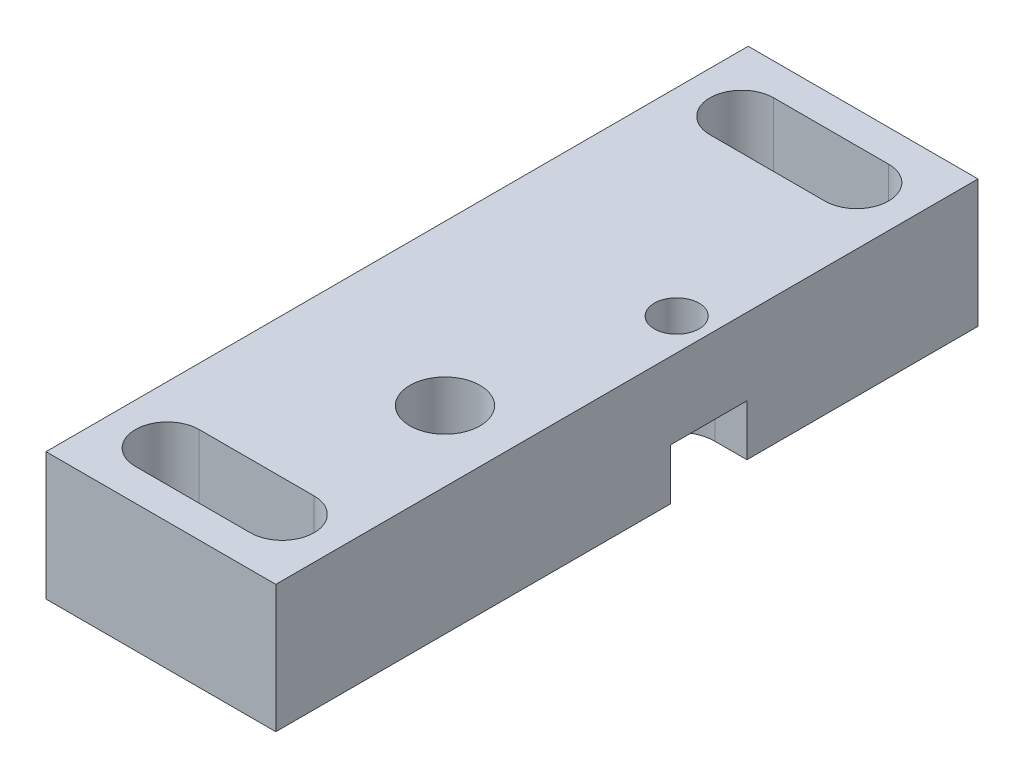
ISO-10303-21;
HEADER;
FILE_DESCRIPTION(('STEP AP214'),'2;1');
FILE_NAME('part.step','',(''),(''),'','','');
FILE_SCHEMA(('AUTOMOTIVE_DESIGN { 1 0 10303 214 1 1 1 1 }'));
ENDSEC;
DATA;
#1=APPLICATION_CONTEXT('core data for automotive mechanical design processes');
#2=APPLICATION_PROTOCOL_DEFINITION('international standard','automotive_design',2000,#1);
#3=PRODUCT_CONTEXT('',#1,'mechanical');
#4=PRODUCT('Part','Part','',(#3));
#5=PRODUCT_RELATED_PRODUCT_CATEGORY('part','',(#4));
#6=PRODUCT_DEFINITION_FORMATION('','',#4);
#7=PRODUCT_DEFINITION_CONTEXT('part definition',#1,'design');
#8=PRODUCT_DEFINITION('design','',#6,#7);
#9=PRODUCT_DEFINITION_SHAPE('','',#8);
#10=(LENGTH_UNIT() NAMED_UNIT(*) SI_UNIT(.MILLI.,.METRE.));
#11=(NAMED_UNIT(*) PLANE_ANGLE_UNIT() SI_UNIT($,.RADIAN.));
#12=(NAMED_UNIT(*) SI_UNIT($,.STERADIAN.) SOLID_ANGLE_UNIT());
#13=UNCERTAINTY_MEASURE_WITH_UNIT(LENGTH_MEASURE(1.E-05),#10,'distance_accuracy_value','');
#14=(GEOMETRIC_REPRESENTATION_CONTEXT(3) GLOBAL_UNCERTAINTY_ASSIGNED_CONTEXT((#13)) GLOBAL_UNIT_ASSIGNED_CONTEXT((#10,
#11,#12)) REPRESENTATION_CONTEXT('',''));
#15=CARTESIAN_POINT('',(0.,0.,0.));
#16=DIRECTION('',(0.,0.,1.));
#17=DIRECTION('',(1.,0.,0.));
#18=AXIS2_PLACEMENT_3D('',#15,#16,#17);
#19=CARTESIAN_POINT('',(0.,10.,0.));
#20=DIRECTION('',(0.,1.,0.));
#21=DIRECTION('',(0.,0.,1.));
#22=AXIS2_PLACEMENT_3D('',#19,#20,#21);
#23=PLANE('',#22);
#24=CARTESIAN_POINT('',(-4.5,10.,22.5));
#25=DIRECTION('',(0.,1.,0.));
#26=DIRECTION('',(0.,0.,1.));
#27=AXIS2_PLACEMENT_3D('',#24,#25,#26);
#28=CIRCLE('',#27,2.5);
#29=CARTESIAN_POINT('',(-4.5,10.,25.));
#30=VERTEX_POINT('',#29);
#31=CARTESIAN_POINT('',(-4.5,10.,20.));
#32=VERTEX_POINT('',#31);
#33=EDGE_CURVE('E188',#30,#32,#28,.F.);
#34=ORIENTED_EDGE('',*,*,#33,.T.);
#35=DIRECTION('',(-1.,0.,0.));
#36=VECTOR('',#35,1.);
#37=CARTESIAN_POINT('',(0.,10.,20.));
#38=LINE('',#37,#36);
#39=CARTESIAN_POINT('',(4.5,10.,20.));
#40=VERTEX_POINT('',#39);
#41=EDGE_CURVE('E195',#40,#32,#38,.T.);
#42=ORIENTED_EDGE('',*,*,#41,.F.);
#43=CARTESIAN_POINT('',(4.5,10.,22.5));
#44=DIRECTION('',(0.,1.,0.));
#45=DIRECTION('',(0.,0.,1.));
#46=AXIS2_PLACEMENT_3D('',#43,#44,#45);
#47=CIRCLE('',#46,2.5);
#48=CARTESIAN_POINT('',(4.5,10.,25.));
#49=VERTEX_POINT('',#48);
#50=EDGE_CURVE('E57',#40,#49,#47,.F.);
#51=ORIENTED_EDGE('',*,*,#50,.T.);
#52=DIRECTION('',(1.,0.,0.));
#53=VECTOR('',#52,1.);
#54=CARTESIAN_POINT('',(0.,10.,25.));
#55=LINE('',#54,#53);
#56=EDGE_CURVE('E191',#30,#49,#55,.T.);
#57=ORIENTED_EDGE('',*,*,#56,.F.);
#58=EDGE_LOOP('',(#34,#42,#51,#57));
#59=FACE_BOUND('',#58,.T.);
#60=CARTESIAN_POINT('',(3.5,10.,8.75000000000001));
#61=DIRECTION('',(0.,1.,0.));
#62=DIRECTION('',(0.,0.,1.));
#63=AXIS2_PLACEMENT_3D('',#60,#61,#62);
#64=CIRCLE('',#63,2.75);
#65=CARTESIAN_POINT('',(3.5,10.,11.5));
#66=VERTEX_POINT('',#65);
#67=EDGE_CURVE('E251',#66,#66,#64,.T.);
#68=ORIENTED_EDGE('',*,*,#67,.F.);
#69=EDGE_LOOP('',(#68));
#70=FACE_BOUND('',#69,.T.);
#71=CARTESIAN_POINT('',(6.5,10.,-6.4));
#72=DIRECTION('',(0.,1.,0.));
#73=DIRECTION('',(0.,0.,1.));
#74=AXIS2_PLACEMENT_3D('',#71,#72,#73);
#75=CIRCLE('',#74,1.75);
#76=CARTESIAN_POINT('',(6.5,10.,-4.65));
#77=VERTEX_POINT('',#76);
#78=EDGE_CURVE('E255',#77,#77,#75,.T.);
#79=ORIENTED_EDGE('',*,*,#78,.F.);
#80=EDGE_LOOP('',(#79));
#81=FACE_BOUND('',#80,.T.);
#82=DIRECTION('',(0.,0.,-1.));
#83=VECTOR('',#82,1.);
#84=CARTESIAN_POINT('',(9.,10.,-27.5));
#85=LINE('',#84,#83);
#86=CARTESIAN_POINT('',(9.,10.,27.5));
#87=VERTEX_POINT('',#86);
#88=CARTESIAN_POINT('',(9.,10.,-27.5));
#89=VERTEX_POINT('',#88);
#90=EDGE_CURVE('E258',#87,#89,#85,.T.);
#91=ORIENTED_EDGE('',*,*,#90,.T.);
#92=DIRECTION('',(-1.,0.,0.));
#93=VECTOR('',#92,1.);
#94=CARTESIAN_POINT('',(-9.,10.,-27.5));
#95=LINE('',#94,#93);
#96=CARTESIAN_POINT('',(-9.,10.,-27.5));
#97=VERTEX_POINT('',#96);
#98=EDGE_CURVE('E261',#89,#97,#95,.T.);
#99=ORIENTED_EDGE('',*,*,#98,.T.);
#100=DIRECTION('',(0.,0.,1.));
#101=VECTOR('',#100,1.);
#102=CARTESIAN_POINT('',(-9.,10.,-27.5));
#103=LINE('',#102,#101);
#104=CARTESIAN_POINT('',(-8.99999999999999,10.,27.5));
#105=VERTEX_POINT('',#104);
#106=EDGE_CURVE('E264',#97,#105,#103,.T.);
#107=ORIENTED_EDGE('',*,*,#106,.T.);
#108=DIRECTION('',(1.,0.,0.));
#109=VECTOR('',#108,1.);
#110=CARTESIAN_POINT('',(-8.99999999999999,10.,27.5));
#111=LINE('',#110,#109);
#112=EDGE_CURVE('E266',#105,#87,#111,.T.);
#113=ORIENTED_EDGE('',*,*,#112,.T.);
#114=EDGE_LOOP('',(#91,#99,#107,#113));
#115=FACE_BOUND('',#114,.T.);
#116=DIRECTION('',(-1.,0.,0.));
#117=VECTOR('',#116,1.);
#118=CARTESIAN_POINT('',(0.,10.,-20.));
#119=LINE('',#118,#117);
#120=CARTESIAN_POINT('',(4.5,10.,-20.));
#121=VERTEX_POINT('',#120);
#122=CARTESIAN_POINT('',(-4.5,10.,-20.));
#123=VERTEX_POINT('',#122);
#124=EDGE_CURVE('E158',#121,#123,#119,.T.);
#125=ORIENTED_EDGE('',*,*,#124,.T.);
#126=CARTESIAN_POINT('',(-4.5,10.,-22.5));
#127=DIRECTION('',(0.,1.,0.));
#128=DIRECTION('',(0.,0.,1.));
#129=AXIS2_PLACEMENT_3D('',#126,#127,#128);
#130=CIRCLE('',#129,2.5);
#131=CARTESIAN_POINT('',(-4.5,10.,-25.));
#132=VERTEX_POINT('',#131);
#133=EDGE_CURVE('E148',#132,#123,#130,.T.);
#134=ORIENTED_EDGE('',*,*,#133,.F.);
#135=DIRECTION('',(1.,0.,0.));
#136=VECTOR('',#135,1.);
#137=CARTESIAN_POINT('',(0.,10.,-25.));
#138=LINE('',#137,#136);
#139=CARTESIAN_POINT('',(4.5,10.,-25.));
#140=VERTEX_POINT('',#139);
#141=EDGE_CURVE('E173',#132,#140,#138,.T.);
#142=ORIENTED_EDGE('',*,*,#141,.T.);
#143=CARTESIAN_POINT('',(4.5,10.,-22.5));
#144=DIRECTION('',(0.,1.,0.));
#145=DIRECTION('',(0.,0.,1.));
#146=AXIS2_PLACEMENT_3D('',#143,#144,#145);
#147=CIRCLE('',#146,2.5);
#148=EDGE_CURVE('E171',#121,#140,#147,.T.);
#149=ORIENTED_EDGE('',*,*,#148,.F.);
#150=EDGE_LOOP('',(#125,#134,#142,#149));
#151=FACE_BOUND('',#150,.T.);
#152=ADVANCED_FACE('F33',(#59,#70,#81,#115,#151),#23,.T.);
#153=CARTESIAN_POINT('',(0.,0.,0.));
#154=DIRECTION('',(0.,1.,0.));
#155=DIRECTION('',(0.,0.,1.));
#156=AXIS2_PLACEMENT_3D('',#153,#154,#155);
#157=PLANE('',#156);
#158=CARTESIAN_POINT('',(6.5,0.,-6.4));
#159=DIRECTION('',(0.,-1.,0.));
#160=DIRECTION('',(0.,0.,-1.));
#161=AXIS2_PLACEMENT_3D('',#158,#159,#160);
#162=CIRCLE('',#161,3.);
#163=CARTESIAN_POINT('',(6.5,0.,-3.4));
#164=VERTEX_POINT('',#163);
#165=CARTESIAN_POINT('',(6.5,0.,-9.4));
#166=VERTEX_POINT('',#165);
#167=EDGE_CURVE('E168',#164,#166,#162,.T.);
#168=ORIENTED_EDGE('',*,*,#167,.F.);
#169=DIRECTION('',(-1.,0.,0.));
#170=VECTOR('',#169,1.);
#171=CARTESIAN_POINT('',(0.,0.,-3.4));
#172=LINE('',#171,#170);
#173=CARTESIAN_POINT('',(9.,0.,-3.4));
#174=VERTEX_POINT('',#173);
#175=EDGE_CURVE('E219',#174,#164,#172,.T.);
#176=ORIENTED_EDGE('',*,*,#175,.F.);
#177=DIRECTION('',(0.,0.,-1.));
#178=VECTOR('',#177,1.);
#179=CARTESIAN_POINT('',(9.,0.,-27.5));
#180=LINE('',#179,#178);
#181=CARTESIAN_POINT('',(9.,0.,27.5));
#182=VERTEX_POINT('',#181);
#183=EDGE_CURVE('E269',#182,#174,#180,.T.);
#184=ORIENTED_EDGE('',*,*,#183,.F.);
#185=DIRECTION('',(1.,0.,0.));
#186=VECTOR('',#185,1.);
#187=CARTESIAN_POINT('',(-8.99999999999999,0.,27.5));
#188=LINE('',#187,#186);
#189=CARTESIAN_POINT('',(-8.99999999999999,0.,27.5));
#190=VERTEX_POINT('',#189);
#191=EDGE_CURVE('E262',#190,#182,#188,.T.);
#192=ORIENTED_EDGE('',*,*,#191,.F.);
#193=DIRECTION('',(0.,0.,1.));
#194=VECTOR('',#193,1.);
#195=CARTESIAN_POINT('',(-9.,0.,-27.5));
#196=LINE('',#195,#194);
#197=CARTESIAN_POINT('',(-9.,0.,-27.5));
#198=VERTEX_POINT('',#197);
#199=EDGE_CURVE('E274',#198,#190,#196,.T.);
#200=ORIENTED_EDGE('',*,*,#199,.F.);
#201=DIRECTION('',(-1.,0.,0.));
#202=VECTOR('',#201,1.);
#203=CARTESIAN_POINT('',(-9.,0.,-27.5));
#204=LINE('',#203,#202);
#205=CARTESIAN_POINT('',(9.,0.,-27.5));
#206=VERTEX_POINT('',#205);
#207=EDGE_CURVE('E272',#206,#198,#204,.T.);
#208=ORIENTED_EDGE('',*,*,#207,.F.);
#209=CARTESIAN_POINT('',(9.,0.,-9.4));
#210=VERTEX_POINT('',#209);
#211=EDGE_CURVE('E254',#210,#206,#180,.T.);
#212=ORIENTED_EDGE('',*,*,#211,.F.);
#213=DIRECTION('',(1.,0.,0.));
#214=VECTOR('',#213,1.);
#215=CARTESIAN_POINT('',(0.,0.,-9.39999999999999));
#216=LINE('',#215,#214);
#217=EDGE_CURVE('E232',#166,#210,#216,.T.);
#218=ORIENTED_EDGE('',*,*,#217,.F.);
#219=EDGE_LOOP('',(#168,#176,#184,#192,#200,#208,#212,#218));
#220=FACE_BOUND('',#219,.T.);
#221=CARTESIAN_POINT('',(3.5,0.,8.75000000000001));
#222=DIRECTION('',(0.,-1.,0.));
#223=DIRECTION('',(0.,0.,-1.));
#224=AXIS2_PLACEMENT_3D('',#221,#222,#223);
#225=CIRCLE('',#224,4.75);
#226=CARTESIAN_POINT('',(3.5,0.,4.00000000000001));
#227=VERTEX_POINT('',#226);
#228=EDGE_CURVE('E238',#227,#227,#225,.T.);
#229=ORIENTED_EDGE('',*,*,#228,.F.);
#230=EDGE_LOOP('',(#229));
#231=FACE_BOUND('',#230,.T.);
#232=DIRECTION('',(-1.,0.,0.));
#233=VECTOR('',#232,1.);
#234=CARTESIAN_POINT('',(0.,0.,20.));
#235=LINE('',#234,#233);
#236=CARTESIAN_POINT('',(4.5,0.,20.));
#237=VERTEX_POINT('',#236);
#238=CARTESIAN_POINT('',(-4.5,0.,20.));
#239=VERTEX_POINT('',#238);
#240=EDGE_CURVE('E192',#237,#239,#235,.T.);
#241=ORIENTED_EDGE('',*,*,#240,.T.);
#242=CARTESIAN_POINT('',(-4.5,0.,22.5));
#243=DIRECTION('',(0.,1.,0.));
#244=DIRECTION('',(0.,0.,1.));
#245=AXIS2_PLACEMENT_3D('',#242,#243,#244);
#246=CIRCLE('',#245,2.5);
#247=CARTESIAN_POINT('',(-4.5,0.,25.));
#248=VERTEX_POINT('',#247);
#249=EDGE_CURVE('E198',#248,#239,#246,.F.);
#250=ORIENTED_EDGE('',*,*,#249,.F.);
#251=DIRECTION('',(1.,0.,0.));
#252=VECTOR('',#251,1.);
#253=CARTESIAN_POINT('',(0.,0.,25.));
#254=LINE('',#253,#252);
#255=CARTESIAN_POINT('',(4.5,0.,25.));
#256=VERTEX_POINT('',#255);
#257=EDGE_CURVE('E200',#248,#256,#254,.T.);
#258=ORIENTED_EDGE('',*,*,#257,.T.);
#259=CARTESIAN_POINT('',(4.5,0.,22.5));
#260=DIRECTION('',(0.,1.,0.));
#261=DIRECTION('',(0.,0.,1.));
#262=AXIS2_PLACEMENT_3D('',#259,#260,#261);
#263=CIRCLE('',#262,2.5);
#264=EDGE_CURVE('E203',#237,#256,#263,.F.);
#265=ORIENTED_EDGE('',*,*,#264,.F.);
#266=EDGE_LOOP('',(#241,#250,#258,#265));
#267=FACE_BOUND('',#266,.T.);
#268=CARTESIAN_POINT('',(-4.5,0.,-22.5));
#269=DIRECTION('',(0.,1.,0.));
#270=DIRECTION('',(0.,0.,1.));
#271=AXIS2_PLACEMENT_3D('',#268,#269,#270);
#272=CIRCLE('',#271,2.5);
#273=CARTESIAN_POINT('',(-4.5,0.,-25.));
#274=VERTEX_POINT('',#273);
#275=CARTESIAN_POINT('',(-4.5,0.,-20.));
#276=VERTEX_POINT('',#275);
#277=EDGE_CURVE('E177',#274,#276,#272,.T.);
#278=ORIENTED_EDGE('',*,*,#277,.T.);
#279=DIRECTION('',(-1.,0.,0.));
#280=VECTOR('',#279,1.);
#281=CARTESIAN_POINT('',(0.,0.,-20.));
#282=LINE('',#281,#280);
#283=CARTESIAN_POINT('',(4.5,0.,-20.));
#284=VERTEX_POINT('',#283);
#285=EDGE_CURVE('E166',#284,#276,#282,.T.);
#286=ORIENTED_EDGE('',*,*,#285,.F.);
#287=CARTESIAN_POINT('',(4.5,0.,-22.5));
#288=DIRECTION('',(0.,1.,0.));
#289=DIRECTION('',(0.,0.,1.));
#290=AXIS2_PLACEMENT_3D('',#287,#288,#289);
#291=CIRCLE('',#290,2.5);
#292=CARTESIAN_POINT('',(4.5,0.,-25.));
#293=VERTEX_POINT('',#292);
#294=EDGE_CURVE('E181',#284,#293,#291,.T.);
#295=ORIENTED_EDGE('',*,*,#294,.T.);
#296=DIRECTION('',(1.,0.,0.));
#297=VECTOR('',#296,1.);
#298=CARTESIAN_POINT('',(0.,0.,-25.));
#299=LINE('',#298,#297);
#300=EDGE_CURVE('E159',#274,#293,#299,.T.);
#301=ORIENTED_EDGE('',*,*,#300,.F.);
#302=EDGE_LOOP('',(#278,#286,#295,#301));
#303=FACE_BOUND('',#302,.T.);
#304=ADVANCED_FACE('F294',(#220,#231,#267,#303),#157,.F.);
#305=CARTESIAN_POINT('',(6.5,0.,-6.4));
#306=DIRECTION('',(0.,1.,0.));
#307=DIRECTION('',(0.,0.,1.));
#308=AXIS2_PLACEMENT_3D('',#305,#306,#307);
#309=CYLINDRICAL_SURFACE('',#308,1.75);
#310=ORIENTED_EDGE('',*,*,#78,.T.);
#311=EDGE_LOOP('',(#310));
#312=FACE_BOUND('',#311,.T.);
#313=CARTESIAN_POINT('',(6.5,4.,-6.4));
#314=DIRECTION('',(0.,-1.,0.));
#315=DIRECTION('',(0.,0.,-1.));
#316=AXIS2_PLACEMENT_3D('',#313,#314,#315);
#317=CIRCLE('',#316,1.75);
#318=CARTESIAN_POINT('',(6.5,4.,-8.14999999999999));
#319=VERTEX_POINT('',#318);
#320=EDGE_CURVE('E215',#319,#319,#317,.F.);
#321=ORIENTED_EDGE('',*,*,#320,.F.);
#322=EDGE_LOOP('',(#321));
#323=FACE_BOUND('',#322,.T.);
#324=ADVANCED_FACE('F322',(#312,#323),#309,.F.);
#325=CARTESIAN_POINT('',(3.5,0.,8.75000000000001));
#326=DIRECTION('',(0.,1.,0.));
#327=DIRECTION('',(0.,0.,1.));
#328=AXIS2_PLACEMENT_3D('',#325,#326,#327);
#329=CYLINDRICAL_SURFACE('',#328,2.75);
#330=ORIENTED_EDGE('',*,*,#67,.T.);
#331=EDGE_LOOP('',(#330));
#332=FACE_BOUND('',#331,.T.);
#333=CARTESIAN_POINT('',(3.5,5.5,8.75000000000001));
#334=DIRECTION('',(0.,-1.,0.));
#335=DIRECTION('',(0.,0.,-1.));
#336=AXIS2_PLACEMENT_3D('',#333,#334,#335);
#337=CIRCLE('',#336,2.75);
#338=CARTESIAN_POINT('',(3.5,5.5,6.00000000000001));
#339=VERTEX_POINT('',#338);
#340=EDGE_CURVE('E37',#339,#339,#337,.F.);
#341=ORIENTED_EDGE('',*,*,#340,.F.);
#342=EDGE_LOOP('',(#341));
#343=FACE_BOUND('',#342,.T.);
#344=ADVANCED_FACE('F315',(#332,#343),#329,.F.);
#345=CARTESIAN_POINT('',(9.,10.,-27.5));
#346=DIRECTION('',(-1.,0.,0.));
#347=DIRECTION('',(0.,0.,1.));
#348=AXIS2_PLACEMENT_3D('',#345,#346,#347);
#349=PLANE('',#348);
#350=ORIENTED_EDGE('',*,*,#183,.T.);
#351=DIRECTION('',(0.,-1.,0.));
#352=VECTOR('',#351,1.);
#353=CARTESIAN_POINT('',(9.,4.,-3.4));
#354=LINE('',#353,#352);
#355=CARTESIAN_POINT('',(9.,4.,-3.4));
#356=VERTEX_POINT('',#355);
#357=EDGE_CURVE('E239',#356,#174,#354,.T.);
#358=ORIENTED_EDGE('',*,*,#357,.F.);
#359=DIRECTION('',(0.,0.,1.));
#360=VECTOR('',#359,1.);
#361=CARTESIAN_POINT('',(9.,4.,0.));
#362=LINE('',#361,#360);
#363=CARTESIAN_POINT('',(9.,4.,-9.4));
#364=VERTEX_POINT('',#363);
#365=EDGE_CURVE('E225',#364,#356,#362,.T.);
#366=ORIENTED_EDGE('',*,*,#365,.F.);
#367=DIRECTION('',(0.,-1.,0.));
#368=VECTOR('',#367,1.);
#369=CARTESIAN_POINT('',(9.,4.,-9.4));
#370=LINE('',#369,#368);
#371=EDGE_CURVE('E241',#364,#210,#370,.T.);
#372=ORIENTED_EDGE('',*,*,#371,.T.);
#373=ORIENTED_EDGE('',*,*,#211,.T.);
#374=DIRECTION('',(0.,-1.,0.));
#375=VECTOR('',#374,1.);
#376=CARTESIAN_POINT('',(9.,10.,-27.5));
#377=LINE('',#376,#375);
#378=EDGE_CURVE('E11',#89,#206,#377,.T.);
#379=ORIENTED_EDGE('',*,*,#378,.F.);
#380=ORIENTED_EDGE('',*,*,#90,.F.);
#381=DIRECTION('',(0.,-1.,0.));
#382=VECTOR('',#381,1.);
#383=CARTESIAN_POINT('',(9.,10.,27.5));
#384=LINE('',#383,#382);
#385=EDGE_CURVE('E268',#87,#182,#384,.T.);
#386=ORIENTED_EDGE('',*,*,#385,.T.);
#387=EDGE_LOOP('',(#350,#358,#366,#372,#373,#379,#380,#386));
#388=FACE_BOUND('',#387,.T.);
#389=ADVANCED_FACE('F35',(#388),#349,.F.);
#390=CARTESIAN_POINT('',(-9.,10.,-27.5));
#391=DIRECTION('',(0.,0.,1.));
#392=DIRECTION('',(1.,0.,0.));
#393=AXIS2_PLACEMENT_3D('',#390,#391,#392);
#394=PLANE('',#393);
#395=ORIENTED_EDGE('',*,*,#207,.T.);
#396=DIRECTION('',(0.,-1.,0.));
#397=VECTOR('',#396,1.);
#398=CARTESIAN_POINT('',(-9.,10.,-27.5));
#399=LINE('',#398,#397);
#400=EDGE_CURVE('E42',#97,#198,#399,.T.);
#401=ORIENTED_EDGE('',*,*,#400,.F.);
#402=ORIENTED_EDGE('',*,*,#98,.F.);
#403=ORIENTED_EDGE('',*,*,#378,.T.);
#404=EDGE_LOOP('',(#395,#401,#402,#403));
#405=FACE_BOUND('',#404,.T.);
#406=ADVANCED_FACE('F308',(#405),#394,.F.);
#407=CARTESIAN_POINT('',(-9.,10.,-27.5));
#408=DIRECTION('',(1.,0.,0.));
#409=DIRECTION('',(0.,0.,-1.));
#410=AXIS2_PLACEMENT_3D('',#407,#408,#409);
#411=PLANE('',#410);
#412=ORIENTED_EDGE('',*,*,#199,.T.);
#413=DIRECTION('',(0.,-1.,0.));
#414=VECTOR('',#413,1.);
#415=CARTESIAN_POINT('',(-8.99999999999999,10.,27.5));
#416=LINE('',#415,#414);
#417=EDGE_CURVE('E279',#105,#190,#416,.T.);
#418=ORIENTED_EDGE('',*,*,#417,.F.);
#419=ORIENTED_EDGE('',*,*,#106,.F.);
#420=ORIENTED_EDGE('',*,*,#400,.T.);
#421=EDGE_LOOP('',(#412,#418,#419,#420));
#422=FACE_BOUND('',#421,.T.);
#423=ADVANCED_FACE('F287',(#422),#411,.F.);
#424=CARTESIAN_POINT('',(-8.99999999999999,10.,27.5));
#425=DIRECTION('',(0.,0.,-1.));
#426=DIRECTION('',(-1.,0.,0.));
#427=AXIS2_PLACEMENT_3D('',#424,#425,#426);
#428=PLANE('',#427);
#429=ORIENTED_EDGE('',*,*,#191,.T.);
#430=ORIENTED_EDGE('',*,*,#385,.F.);
#431=ORIENTED_EDGE('',*,*,#112,.F.);
#432=ORIENTED_EDGE('',*,*,#417,.T.);
#433=EDGE_LOOP('',(#429,#430,#431,#432));
#434=FACE_BOUND('',#433,.T.);
#435=ADVANCED_FACE('F301',(#434),#428,.F.);
#436=CARTESIAN_POINT('',(3.5,5.5,8.75000000000001));
#437=DIRECTION('',(0.,-1.,0.));
#438=DIRECTION('',(0.,0.,-1.));
#439=AXIS2_PLACEMENT_3D('',#436,#437,#438);
#440=PLANE('',#439);
#441=CARTESIAN_POINT('',(3.5,5.5,8.75000000000001));
#442=DIRECTION('',(0.,-1.,0.));
#443=DIRECTION('',(0.,0.,-1.));
#444=AXIS2_PLACEMENT_3D('',#441,#442,#443);
#445=CIRCLE('',#444,4.75);
#446=CARTESIAN_POINT('',(3.5,5.5,4.00000000000001));
#447=VERTEX_POINT('',#446);
#448=EDGE_CURVE('E246',#447,#447,#445,.T.);
#449=ORIENTED_EDGE('',*,*,#448,.T.);
#450=EDGE_LOOP('',(#449));
#451=FACE_BOUND('',#450,.T.);
#452=ORIENTED_EDGE('',*,*,#340,.T.);
#453=EDGE_LOOP('',(#452));
#454=FACE_BOUND('',#453,.T.);
#455=ADVANCED_FACE('F329',(#451,#454),#440,.T.);
#456=CARTESIAN_POINT('',(3.5,5.5,8.75000000000001));
#457=DIRECTION('',(0.,-1.,0.));
#458=DIRECTION('',(0.,0.,-1.));
#459=AXIS2_PLACEMENT_3D('',#456,#457,#458);
#460=CYLINDRICAL_SURFACE('',#459,4.75);
#461=ORIENTED_EDGE('',*,*,#448,.F.);
#462=EDGE_LOOP('',(#461));
#463=FACE_BOUND('',#462,.T.);
#464=ORIENTED_EDGE('',*,*,#228,.T.);
#465=EDGE_LOOP('',(#464));
#466=FACE_BOUND('',#465,.T.);
#467=ADVANCED_FACE('F333',(#463,#466),#460,.F.);
#468=CARTESIAN_POINT('',(6.5,4.,-6.4));
#469=DIRECTION('',(0.,-1.,0.));
#470=DIRECTION('',(0.,0.,-1.));
#471=AXIS2_PLACEMENT_3D('',#468,#469,#470);
#472=CYLINDRICAL_SURFACE('',#471,3.);
#473=ORIENTED_EDGE('',*,*,#167,.T.);
#474=DIRECTION('',(0.,-1.,0.));
#475=VECTOR('',#474,1.);
#476=CARTESIAN_POINT('',(6.5,4.,-9.4));
#477=LINE('',#476,#475);
#478=CARTESIAN_POINT('',(6.5,4.,-9.4));
#479=VERTEX_POINT('',#478);
#480=EDGE_CURVE('E230',#479,#166,#477,.T.);
#481=ORIENTED_EDGE('',*,*,#480,.F.);
#482=CARTESIAN_POINT('',(6.5,4.,-6.4));
#483=DIRECTION('',(0.,-1.,0.));
#484=DIRECTION('',(0.,0.,-1.));
#485=AXIS2_PLACEMENT_3D('',#482,#483,#484);
#486=CIRCLE('',#485,3.);
#487=CARTESIAN_POINT('',(6.5,4.,-3.4));
#488=VERTEX_POINT('',#487);
#489=EDGE_CURVE('E218',#488,#479,#486,.T.);
#490=ORIENTED_EDGE('',*,*,#489,.F.);
#491=DIRECTION('',(0.,-1.,0.));
#492=VECTOR('',#491,1.);
#493=CARTESIAN_POINT('',(6.5,4.,-3.4));
#494=LINE('',#493,#492);
#495=EDGE_CURVE('E236',#488,#164,#494,.T.);
#496=ORIENTED_EDGE('',*,*,#495,.T.);
#497=EDGE_LOOP('',(#473,#481,#490,#496));
#498=FACE_BOUND('',#497,.T.);
#499=ADVANCED_FACE('F339',(#498),#472,.F.);
#500=CARTESIAN_POINT('',(0.,4.,-3.4));
#501=DIRECTION('',(0.,0.,1.));
#502=DIRECTION('',(1.,0.,0.));
#503=AXIS2_PLACEMENT_3D('',#500,#501,#502);
#504=PLANE('',#503);
#505=ORIENTED_EDGE('',*,*,#175,.T.);
#506=ORIENTED_EDGE('',*,*,#495,.F.);
#507=DIRECTION('',(-1.,0.,0.));
#508=VECTOR('',#507,1.);
#509=CARTESIAN_POINT('',(0.,4.,-3.4));
#510=LINE('',#509,#508);
#511=EDGE_CURVE('E227',#356,#488,#510,.T.);
#512=ORIENTED_EDGE('',*,*,#511,.F.);
#513=ORIENTED_EDGE('',*,*,#357,.T.);
#514=EDGE_LOOP('',(#505,#506,#512,#513));
#515=FACE_BOUND('',#514,.T.);
#516=ADVANCED_FACE('F374',(#515),#504,.F.);
#517=CARTESIAN_POINT('',(0.,4.,-9.39999999999999));
#518=DIRECTION('',(0.,0.,-1.));
#519=DIRECTION('',(-1.,0.,0.));
#520=AXIS2_PLACEMENT_3D('',#517,#518,#519);
#521=PLANE('',#520);
#522=ORIENTED_EDGE('',*,*,#217,.T.);
#523=ORIENTED_EDGE('',*,*,#371,.F.);
#524=DIRECTION('',(1.,0.,0.));
#525=VECTOR('',#524,1.);
#526=CARTESIAN_POINT('',(0.,4.,-9.39999999999999));
#527=LINE('',#526,#525);
#528=EDGE_CURVE('E222',#479,#364,#527,.T.);
#529=ORIENTED_EDGE('',*,*,#528,.F.);
#530=ORIENTED_EDGE('',*,*,#480,.T.);
#531=EDGE_LOOP('',(#522,#523,#529,#530));
#532=FACE_BOUND('',#531,.T.);
#533=ADVANCED_FACE('F364',(#532),#521,.F.);
#534=CARTESIAN_POINT('',(0.,4.,0.));
#535=DIRECTION('',(0.,-1.,0.));
#536=DIRECTION('',(0.,0.,-1.));
#537=AXIS2_PLACEMENT_3D('',#534,#535,#536);
#538=PLANE('',#537);
#539=ORIENTED_EDGE('',*,*,#320,.T.);
#540=EDGE_LOOP('',(#539));
#541=FACE_BOUND('',#540,.T.);
#542=ORIENTED_EDGE('',*,*,#489,.T.);
#543=ORIENTED_EDGE('',*,*,#528,.T.);
#544=ORIENTED_EDGE('',*,*,#365,.T.);
#545=ORIENTED_EDGE('',*,*,#511,.T.);
#546=EDGE_LOOP('',(#542,#543,#544,#545));
#547=FACE_BOUND('',#546,.T.);
#548=ADVANCED_FACE('F360',(#541,#547),#538,.T.);
#549=CARTESIAN_POINT('',(-4.5,10.,22.5));
#550=DIRECTION('',(0.,-1.,0.));
#551=DIRECTION('',(0.,0.,-1.));
#552=AXIS2_PLACEMENT_3D('',#549,#550,#551);
#553=CYLINDRICAL_SURFACE('',#552,2.5);
#554=ORIENTED_EDGE('',*,*,#249,.T.);
#555=DIRECTION('',(0.,-1.,0.));
#556=VECTOR('',#555,1.);
#557=CARTESIAN_POINT('',(-4.5,10.,20.));
#558=LINE('',#557,#556);
#559=EDGE_CURVE('E197',#32,#239,#558,.T.);
#560=ORIENTED_EDGE('',*,*,#559,.F.);
#561=ORIENTED_EDGE('',*,*,#33,.F.);
#562=DIRECTION('',(0.,-1.,0.));
#563=VECTOR('',#562,1.);
#564=CARTESIAN_POINT('',(-4.5,10.,25.));
#565=LINE('',#564,#563);
#566=EDGE_CURVE('E179',#30,#248,#565,.T.);
#567=ORIENTED_EDGE('',*,*,#566,.T.);
#568=EDGE_LOOP('',(#554,#560,#561,#567));
#569=FACE_BOUND('',#568,.T.);
#570=ADVANCED_FACE('F363',(#569),#553,.F.);
#571=CARTESIAN_POINT('',(0.,10.,25.));
#572=DIRECTION('',(0.,0.,-1.));
#573=DIRECTION('',(-1.,0.,0.));
#574=AXIS2_PLACEMENT_3D('',#571,#572,#573);
#575=PLANE('',#574);
#576=ORIENTED_EDGE('',*,*,#257,.F.);
#577=ORIENTED_EDGE('',*,*,#566,.F.);
#578=ORIENTED_EDGE('',*,*,#56,.T.);
#579=DIRECTION('',(0.,-1.,0.));
#580=VECTOR('',#579,1.);
#581=CARTESIAN_POINT('',(4.5,10.,25.));
#582=LINE('',#581,#580);
#583=EDGE_CURVE('E212',#49,#256,#582,.T.);
#584=ORIENTED_EDGE('',*,*,#583,.T.);
#585=EDGE_LOOP('',(#576,#577,#578,#584));
#586=FACE_BOUND('',#585,.T.);
#587=ADVANCED_FACE('F384',(#586),#575,.T.);
#588=CARTESIAN_POINT('',(4.5,10.,22.5));
#589=DIRECTION('',(0.,-1.,0.));
#590=DIRECTION('',(0.,0.,-1.));
#591=AXIS2_PLACEMENT_3D('',#588,#589,#590);
#592=CYLINDRICAL_SURFACE('',#591,2.5);
#593=ORIENTED_EDGE('',*,*,#264,.T.);
#594=ORIENTED_EDGE('',*,*,#583,.F.);
#595=ORIENTED_EDGE('',*,*,#50,.F.);
#596=DIRECTION('',(0.,-1.,0.));
#597=VECTOR('',#596,1.);
#598=CARTESIAN_POINT('',(4.5,10.,20.));
#599=LINE('',#598,#597);
#600=EDGE_CURVE('E210',#40,#237,#599,.T.);
#601=ORIENTED_EDGE('',*,*,#600,.T.);
#602=EDGE_LOOP('',(#593,#594,#595,#601));
#603=FACE_BOUND('',#602,.T.);
#604=ADVANCED_FACE('F388',(#603),#592,.F.);
#605=CARTESIAN_POINT('',(0.,10.,20.));
#606=DIRECTION('',(0.,0.,1.));
#607=DIRECTION('',(1.,0.,0.));
#608=AXIS2_PLACEMENT_3D('',#605,#606,#607);
#609=PLANE('',#608);
#610=ORIENTED_EDGE('',*,*,#240,.F.);
#611=ORIENTED_EDGE('',*,*,#600,.F.);
#612=ORIENTED_EDGE('',*,*,#41,.T.);
#613=ORIENTED_EDGE('',*,*,#559,.T.);
#614=EDGE_LOOP('',(#610,#611,#612,#613));
#615=FACE_BOUND('',#614,.T.);
#616=ADVANCED_FACE('F392',(#615),#609,.T.);
#617=CARTESIAN_POINT('',(-4.5,10.,-22.5));
#618=DIRECTION('',(0.,-1.,0.));
#619=DIRECTION('',(0.,0.,-1.));
#620=AXIS2_PLACEMENT_3D('',#617,#618,#619);
#621=CYLINDRICAL_SURFACE('',#620,2.5);
#622=ORIENTED_EDGE('',*,*,#277,.F.);
#623=DIRECTION('',(0.,-1.,0.));
#624=VECTOR('',#623,1.);
#625=CARTESIAN_POINT('',(-4.5,10.,-25.));
#626=LINE('',#625,#624);
#627=EDGE_CURVE('E154',#132,#274,#626,.T.);
#628=ORIENTED_EDGE('',*,*,#627,.F.);
#629=ORIENTED_EDGE('',*,*,#133,.T.);
#630=DIRECTION('',(0.,-1.,0.));
#631=VECTOR('',#630,1.);
#632=CARTESIAN_POINT('',(-4.5,10.,-20.));
#633=LINE('',#632,#631);
#634=EDGE_CURVE('E151',#123,#276,#633,.T.);
#635=ORIENTED_EDGE('',*,*,#634,.T.);
#636=EDGE_LOOP('',(#622,#628,#629,#635));
#637=FACE_BOUND('',#636,.T.);
#638=ADVANCED_FACE('F150',(#637),#621,.F.);
#639=CARTESIAN_POINT('',(0.,10.,-20.));
#640=DIRECTION('',(0.,0.,1.));
#641=DIRECTION('',(1.,0.,0.));
#642=AXIS2_PLACEMENT_3D('',#639,#640,#641);
#643=PLANE('',#642);
#644=ORIENTED_EDGE('',*,*,#285,.T.);
#645=ORIENTED_EDGE('',*,*,#634,.F.);
#646=ORIENTED_EDGE('',*,*,#124,.F.);
#647=DIRECTION('',(0.,-1.,0.));
#648=VECTOR('',#647,1.);
#649=CARTESIAN_POINT('',(4.5,10.,-20.));
#650=LINE('',#649,#648);
#651=EDGE_CURVE('E169',#121,#284,#650,.T.);
#652=ORIENTED_EDGE('',*,*,#651,.T.);
#653=EDGE_LOOP('',(#644,#645,#646,#652));
#654=FACE_BOUND('',#653,.T.);
#655=ADVANCED_FACE('F163',(#654),#643,.F.);
#656=CARTESIAN_POINT('',(4.5,10.,-22.5));
#657=DIRECTION('',(0.,-1.,0.));
#658=DIRECTION('',(0.,0.,-1.));
#659=AXIS2_PLACEMENT_3D('',#656,#657,#658);
#660=CYLINDRICAL_SURFACE('',#659,2.5);
#661=ORIENTED_EDGE('',*,*,#294,.F.);
#662=ORIENTED_EDGE('',*,*,#651,.F.);
#663=ORIENTED_EDGE('',*,*,#148,.T.);
#664=DIRECTION('',(0.,-1.,0.));
#665=VECTOR('',#664,1.);
#666=CARTESIAN_POINT('',(4.5,10.,-25.));
#667=LINE('',#666,#665);
#668=EDGE_CURVE('E49',#140,#293,#667,.T.);
#669=ORIENTED_EDGE('',*,*,#668,.T.);
#670=EDGE_LOOP('',(#661,#662,#663,#669));
#671=FACE_BOUND('',#670,.T.);
#672=ADVANCED_FACE('F400',(#671),#660,.F.);
#673=CARTESIAN_POINT('',(0.,10.,-25.));
#674=DIRECTION('',(0.,0.,-1.));
#675=DIRECTION('',(-1.,0.,0.));
#676=AXIS2_PLACEMENT_3D('',#673,#674,#675);
#677=PLANE('',#676);
#678=ORIENTED_EDGE('',*,*,#300,.T.);
#679=ORIENTED_EDGE('',*,*,#668,.F.);
#680=ORIENTED_EDGE('',*,*,#141,.F.);
#681=ORIENTED_EDGE('',*,*,#627,.T.);
#682=EDGE_LOOP('',(#678,#679,#680,#681));
#683=FACE_BOUND('',#682,.T.);
#684=ADVANCED_FACE('F403',(#683),#677,.F.);
#685=CLOSED_SHELL('',(#152,#304,#324,#344,#389,#406,#423,#435,#455,#467,#499,#516,#533,#548,
#570,#587,#604,#616,#638,#655,#672,#684));
#686=MANIFOLD_SOLID_BREP('B2',#685);
#687=ADVANCED_BREP_SHAPE_REPRESENTATION('',(#18,#686),#14);
#688=SHAPE_DEFINITION_REPRESENTATION(#9,#687);
ENDSEC;
END-ISO-10303-21;
